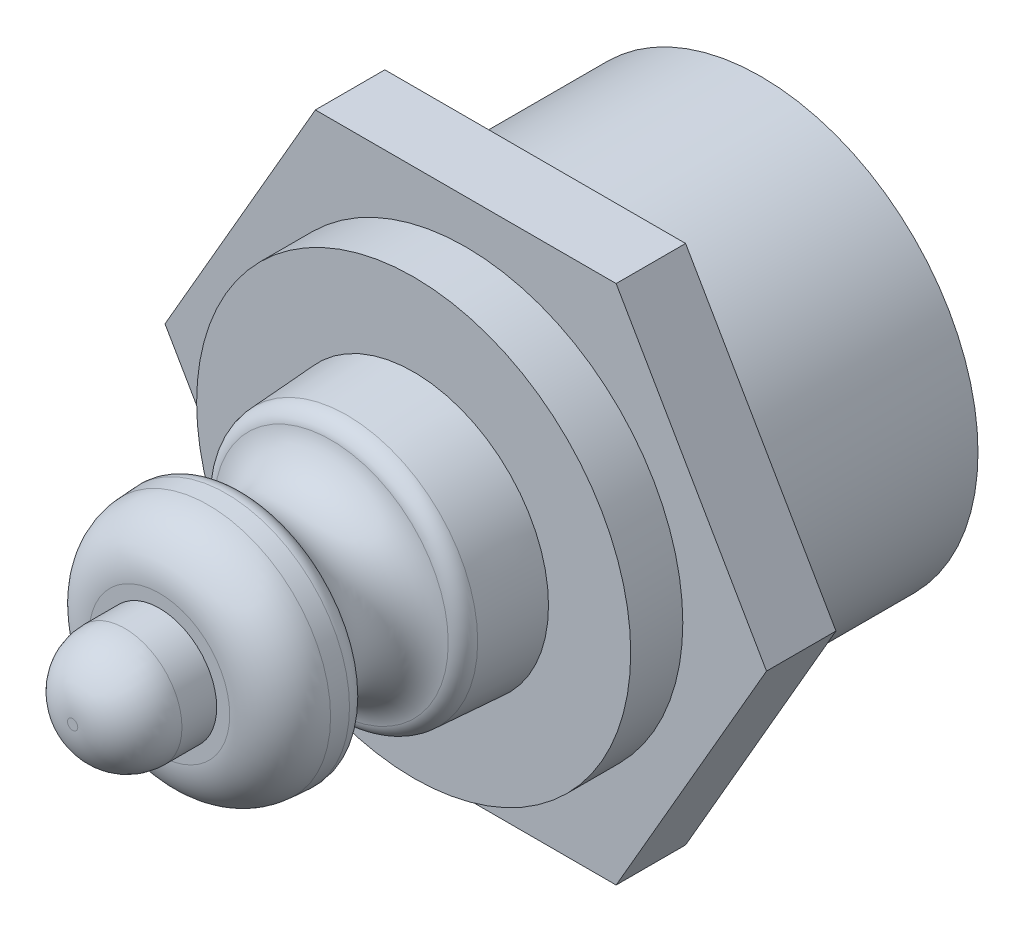
ISO-10303-21;
HEADER;
FILE_DESCRIPTION(('STEP AP214'),'2;1');
FILE_NAME('part.step','',(''),(''),'','','');
FILE_SCHEMA(('AUTOMOTIVE_DESIGN { 1 0 10303 214 1 1 1 1 }'));
ENDSEC;
DATA;
#1=APPLICATION_CONTEXT('core data for automotive mechanical design processes');
#2=APPLICATION_PROTOCOL_DEFINITION('international standard','automotive_design',2000,#1);
#3=PRODUCT_CONTEXT('',#1,'mechanical');
#4=PRODUCT('Part','Part','',(#3));
#5=PRODUCT_RELATED_PRODUCT_CATEGORY('part','',(#4));
#6=PRODUCT_DEFINITION_FORMATION('','',#4);
#7=PRODUCT_DEFINITION_CONTEXT('part definition',#1,'design');
#8=PRODUCT_DEFINITION('design','',#6,#7);
#9=PRODUCT_DEFINITION_SHAPE('','',#8);
#10=(LENGTH_UNIT() NAMED_UNIT(*) SI_UNIT(.MILLI.,.METRE.));
#11=(NAMED_UNIT(*) PLANE_ANGLE_UNIT() SI_UNIT($,.RADIAN.));
#12=(NAMED_UNIT(*) SI_UNIT($,.STERADIAN.) SOLID_ANGLE_UNIT());
#13=UNCERTAINTY_MEASURE_WITH_UNIT(LENGTH_MEASURE(1.E-05),#10,'distance_accuracy_value','');
#14=(GEOMETRIC_REPRESENTATION_CONTEXT(3) GLOBAL_UNCERTAINTY_ASSIGNED_CONTEXT((#13)) GLOBAL_UNIT_ASSIGNED_CONTEXT((#10,
#11,#12)) REPRESENTATION_CONTEXT('',''));
#15=CARTESIAN_POINT('',(0.,0.,0.));
#16=DIRECTION('',(0.,0.,1.));
#17=DIRECTION('',(1.,0.,0.));
#18=AXIS2_PLACEMENT_3D('',#15,#16,#17);
#19=CARTESIAN_POINT('',(-4.36075673625272,0.,21.9961999834404));
#20=DIRECTION('',(0.,0.,1.));
#21=DIRECTION('',(1.,0.,0.));
#22=AXIS2_PLACEMENT_3D('',#19,#20,#21);
#23=PLANE('',#22);
#24=CARTESIAN_POINT('',(0.,0.,21.9961999834404));
#25=DIRECTION('',(0.,0.,1.));
#26=DIRECTION('',(1.,0.,0.));
#27=AXIS2_PLACEMENT_3D('',#24,#25,#26);
#28=CIRCLE('',#27,2.56904320901737);
#29=CARTESIAN_POINT('',(2.56904320901737,0.,21.9961999834404));
#30=VERTEX_POINT('',#29);
#31=EDGE_CURVE('E160',#30,#30,#28,.T.);
#32=ORIENTED_EDGE('',*,*,#31,.T.);
#33=EDGE_LOOP('',(#32));
#34=FACE_BOUND('',#33,.T.);
#35=CARTESIAN_POINT('',(0.,0.,21.9961999834404));
#36=DIRECTION('',(0.,0.,1.));
#37=DIRECTION('',(1.,0.,0.));
#38=AXIS2_PLACEMENT_3D('',#35,#36,#37);
#39=CIRCLE('',#38,2.09240752733974);
#40=CARTESIAN_POINT('',(2.09240752733974,0.,21.9961999834404));
#41=VERTEX_POINT('',#40);
#42=EDGE_CURVE('E123',#41,#41,#39,.T.);
#43=ORIENTED_EDGE('',*,*,#42,.F.);
#44=EDGE_LOOP('',(#43));
#45=FACE_BOUND('',#44,.T.);
#46=ADVANCED_FACE('F30',(#34,#45),#23,.T.);
#47=CARTESIAN_POINT('',(0.,0.,12.7));
#48=DIRECTION('',(0.,0.,-1.));
#49=DIRECTION('',(-1.,0.,0.));
#50=AXIS2_PLACEMENT_3D('',#47,#48,#49);
#51=CYLINDRICAL_SURFACE('',#50,7.9375);
#52=CARTESIAN_POINT('',(0.,0.,0.));
#53=DIRECTION('',(0.,0.,1.));
#54=DIRECTION('',(1.,0.,0.));
#55=AXIS2_PLACEMENT_3D('',#52,#53,#54);
#56=CIRCLE('',#55,7.9375);
#57=CARTESIAN_POINT('',(7.9375,0.,0.));
#58=VERTEX_POINT('',#57);
#59=EDGE_CURVE('E147',#58,#58,#56,.T.);
#60=ORIENTED_EDGE('',*,*,#59,.T.);
#61=EDGE_LOOP('',(#60));
#62=FACE_BOUND('',#61,.T.);
#63=CARTESIAN_POINT('',(0.,0.,8.255));
#64=DIRECTION('',(0.,0.,1.));
#65=DIRECTION('',(1.,0.,0.));
#66=AXIS2_PLACEMENT_3D('',#63,#64,#65);
#67=CIRCLE('',#66,7.9375);
#68=CARTESIAN_POINT('',(7.9375,0.,8.255));
#69=VERTEX_POINT('',#68);
#70=EDGE_CURVE('E146',#69,#69,#67,.T.);
#71=ORIENTED_EDGE('',*,*,#70,.F.);
#72=EDGE_LOOP('',(#71));
#73=FACE_BOUND('',#72,.T.);
#74=ADVANCED_FACE('F203',(#62,#73),#51,.T.);
#75=CARTESIAN_POINT('',(0.,0.,0.));
#76=DIRECTION('',(0.,0.,1.));
#77=DIRECTION('',(1.,0.,0.));
#78=AXIS2_PLACEMENT_3D('',#75,#76,#77);
#79=PLANE('',#78);
#80=ORIENTED_EDGE('',*,*,#59,.F.);
#81=EDGE_LOOP('',(#80));
#82=FACE_BOUND('',#81,.T.);
#83=ADVANCED_FACE('F209',(#82),#79,.F.);
#84=CARTESIAN_POINT('',(5.49926131403119,9.525,8.255));
#85=DIRECTION('',(0.,0.,1.));
#86=DIRECTION('',(1.,0.,0.));
#87=AXIS2_PLACEMENT_3D('',#84,#85,#86);
#88=PLANE('',#87);
#89=DIRECTION('',(-0.5,0.866025403784439,0.));
#90=VECTOR('',#89,1.);
#91=CARTESIAN_POINT('',(10.9985226280624,0.,8.255));
#92=LINE('',#91,#90);
#93=CARTESIAN_POINT('',(10.9985226280624,0.,8.255));
#94=VERTEX_POINT('',#93);
#95=CARTESIAN_POINT('',(5.49926131403119,9.525,8.255));
#96=VERTEX_POINT('',#95);
#97=EDGE_CURVE('E135',#94,#96,#92,.T.);
#98=ORIENTED_EDGE('',*,*,#97,.F.);
#99=DIRECTION('',(0.5,0.866025403784439,0.));
#100=VECTOR('',#99,1.);
#101=CARTESIAN_POINT('',(5.49926131403118,-9.525,8.255));
#102=LINE('',#101,#100);
#103=CARTESIAN_POINT('',(5.49926131403118,-9.525,8.255));
#104=VERTEX_POINT('',#103);
#105=EDGE_CURVE('E109',#104,#94,#102,.T.);
#106=ORIENTED_EDGE('',*,*,#105,.F.);
#107=DIRECTION('',(1.,0.,0.));
#108=VECTOR('',#107,1.);
#109=CARTESIAN_POINT('',(-5.49926131403119,-9.525,8.255));
#110=LINE('',#109,#108);
#111=CARTESIAN_POINT('',(-5.49926131403119,-9.525,8.255));
#112=VERTEX_POINT('',#111);
#113=EDGE_CURVE('E93',#112,#104,#110,.T.);
#114=ORIENTED_EDGE('',*,*,#113,.F.);
#115=DIRECTION('',(0.5,-0.866025403784439,0.));
#116=VECTOR('',#115,1.);
#117=CARTESIAN_POINT('',(-10.9985226280624,0.,8.255));
#118=LINE('',#117,#116);
#119=CARTESIAN_POINT('',(-10.9985226280624,0.,8.255));
#120=VERTEX_POINT('',#119);
#121=EDGE_CURVE('E107',#120,#112,#118,.T.);
#122=ORIENTED_EDGE('',*,*,#121,.F.);
#123=DIRECTION('',(-0.5,-0.866025403784439,0.));
#124=VECTOR('',#123,1.);
#125=CARTESIAN_POINT('',(-5.49926131403119,9.525,8.255));
#126=LINE('',#125,#124);
#127=CARTESIAN_POINT('',(-5.49926131403119,9.525,8.255));
#128=VERTEX_POINT('',#127);
#129=EDGE_CURVE('E112',#128,#120,#126,.T.);
#130=ORIENTED_EDGE('',*,*,#129,.F.);
#131=DIRECTION('',(-1.,0.,0.));
#132=VECTOR('',#131,1.);
#133=CARTESIAN_POINT('',(5.49926131403119,9.525,8.255));
#134=LINE('',#133,#132);
#135=EDGE_CURVE('E114',#96,#128,#134,.T.);
#136=ORIENTED_EDGE('',*,*,#135,.F.);
#137=EDGE_LOOP('',(#98,#106,#114,#122,#130,#136));
#138=FACE_BOUND('',#137,.T.);
#139=ORIENTED_EDGE('',*,*,#70,.T.);
#140=EDGE_LOOP('',(#139));
#141=FACE_BOUND('',#140,.T.);
#142=ADVANCED_FACE('F104',(#138,#141),#88,.F.);
#143=CARTESIAN_POINT('',(5.49926131403119,9.525,10.795));
#144=DIRECTION('',(0.,0.,1.));
#145=DIRECTION('',(1.,0.,0.));
#146=AXIS2_PLACEMENT_3D('',#143,#144,#145);
#147=PLANE('',#146);
#148=DIRECTION('',(-0.5,0.866025403784439,0.));
#149=VECTOR('',#148,1.);
#150=CARTESIAN_POINT('',(10.9985226280624,0.,10.795));
#151=LINE('',#150,#149);
#152=CARTESIAN_POINT('',(10.9985226280624,0.,10.795));
#153=VERTEX_POINT('',#152);
#154=CARTESIAN_POINT('',(5.49926131403119,9.525,10.795));
#155=VERTEX_POINT('',#154);
#156=EDGE_CURVE('E119',#153,#155,#151,.T.);
#157=ORIENTED_EDGE('',*,*,#156,.T.);
#158=DIRECTION('',(-1.,0.,0.));
#159=VECTOR('',#158,1.);
#160=CARTESIAN_POINT('',(5.49926131403119,9.525,10.795));
#161=LINE('',#160,#159);
#162=CARTESIAN_POINT('',(-5.49926131403119,9.525,10.795));
#163=VERTEX_POINT('',#162);
#164=EDGE_CURVE('E122',#155,#163,#161,.T.);
#165=ORIENTED_EDGE('',*,*,#164,.T.);
#166=DIRECTION('',(-0.5,-0.866025403784439,0.));
#167=VECTOR('',#166,1.);
#168=CARTESIAN_POINT('',(-5.49926131403119,9.525,10.795));
#169=LINE('',#168,#167);
#170=CARTESIAN_POINT('',(-10.9985226280624,0.,10.795));
#171=VERTEX_POINT('',#170);
#172=EDGE_CURVE('E126',#163,#171,#169,.T.);
#173=ORIENTED_EDGE('',*,*,#172,.T.);
#174=DIRECTION('',(0.5,-0.866025403784439,0.));
#175=VECTOR('',#174,1.);
#176=CARTESIAN_POINT('',(-10.9985226280624,0.,10.795));
#177=LINE('',#176,#175);
#178=CARTESIAN_POINT('',(-5.49926131403119,-9.525,10.795));
#179=VERTEX_POINT('',#178);
#180=EDGE_CURVE('E129',#171,#179,#177,.T.);
#181=ORIENTED_EDGE('',*,*,#180,.T.);
#182=DIRECTION('',(1.,0.,0.));
#183=VECTOR('',#182,1.);
#184=CARTESIAN_POINT('',(-5.49926131403119,-9.525,10.795));
#185=LINE('',#184,#183);
#186=CARTESIAN_POINT('',(5.49926131403118,-9.525,10.795));
#187=VERTEX_POINT('',#186);
#188=EDGE_CURVE('E95',#179,#187,#185,.T.);
#189=ORIENTED_EDGE('',*,*,#188,.T.);
#190=DIRECTION('',(0.5,0.866025403784439,0.));
#191=VECTOR('',#190,1.);
#192=CARTESIAN_POINT('',(5.49926131403118,-9.525,10.795));
#193=LINE('',#192,#191);
#194=EDGE_CURVE('E132',#187,#153,#193,.T.);
#195=ORIENTED_EDGE('',*,*,#194,.T.);
#196=EDGE_LOOP('',(#157,#165,#173,#181,#189,#195));
#197=FACE_BOUND('',#196,.T.);
#198=CARTESIAN_POINT('',(0.,0.,10.795));
#199=DIRECTION('',(0.,0.,1.));
#200=DIRECTION('',(1.,0.,0.));
#201=AXIS2_PLACEMENT_3D('',#198,#199,#200);
#202=CIRCLE('',#201,7.9375);
#203=CARTESIAN_POINT('',(7.9375,0.,10.795));
#204=VERTEX_POINT('',#203);
#205=EDGE_CURVE('E137',#204,#204,#202,.T.);
#206=ORIENTED_EDGE('',*,*,#205,.F.);
#207=EDGE_LOOP('',(#206));
#208=FACE_BOUND('',#207,.T.);
#209=ADVANCED_FACE('F230',(#197,#208),#147,.T.);
#210=CARTESIAN_POINT('',(10.9985226280624,0.,8.255));
#211=DIRECTION('',(0.866025403784439,0.5,0.));
#212=DIRECTION('',(-0.5,0.866025403784439,0.));
#213=AXIS2_PLACEMENT_3D('',#210,#211,#212);
#214=PLANE('',#213);
#215=ORIENTED_EDGE('',*,*,#156,.F.);
#216=DIRECTION('',(0.,0.,1.));
#217=VECTOR('',#216,1.);
#218=CARTESIAN_POINT('',(10.9985226280624,0.,8.255));
#219=LINE('',#218,#217);
#220=EDGE_CURVE('E47',#94,#153,#219,.T.);
#221=ORIENTED_EDGE('',*,*,#220,.F.);
#222=ORIENTED_EDGE('',*,*,#97,.T.);
#223=DIRECTION('',(0.,0.,1.));
#224=VECTOR('',#223,1.);
#225=CARTESIAN_POINT('',(5.49926131403119,9.525,8.255));
#226=LINE('',#225,#224);
#227=EDGE_CURVE('E82',#96,#155,#226,.T.);
#228=ORIENTED_EDGE('',*,*,#227,.T.);
#229=EDGE_LOOP('',(#215,#221,#222,#228));
#230=FACE_BOUND('',#229,.T.);
#231=ADVANCED_FACE('F233',(#230),#214,.T.);
#232=CARTESIAN_POINT('',(5.49926131403118,-9.525,8.255));
#233=DIRECTION('',(0.866025403784439,-0.5,0.));
#234=DIRECTION('',(0.5,0.866025403784439,0.));
#235=AXIS2_PLACEMENT_3D('',#232,#233,#234);
#236=PLANE('',#235);
#237=ORIENTED_EDGE('',*,*,#194,.F.);
#238=DIRECTION('',(0.,0.,1.));
#239=VECTOR('',#238,1.);
#240=CARTESIAN_POINT('',(5.49926131403118,-9.525,8.255));
#241=LINE('',#240,#239);
#242=EDGE_CURVE('E70',#104,#187,#241,.T.);
#243=ORIENTED_EDGE('',*,*,#242,.F.);
#244=ORIENTED_EDGE('',*,*,#105,.T.);
#245=ORIENTED_EDGE('',*,*,#220,.T.);
#246=EDGE_LOOP('',(#237,#243,#244,#245));
#247=FACE_BOUND('',#246,.T.);
#248=ADVANCED_FACE('F235',(#247),#236,.T.);
#249=CARTESIAN_POINT('',(-5.49926131403119,-9.525,8.255));
#250=DIRECTION('',(0.,-1.,0.));
#251=DIRECTION('',(0.,0.,-1.));
#252=AXIS2_PLACEMENT_3D('',#249,#250,#251);
#253=PLANE('',#252);
#254=ORIENTED_EDGE('',*,*,#188,.F.);
#255=DIRECTION('',(0.,0.,1.));
#256=VECTOR('',#255,1.);
#257=CARTESIAN_POINT('',(-5.49926131403119,-9.525,8.255));
#258=LINE('',#257,#256);
#259=EDGE_CURVE('E90',#112,#179,#258,.T.);
#260=ORIENTED_EDGE('',*,*,#259,.F.);
#261=ORIENTED_EDGE('',*,*,#113,.T.);
#262=ORIENTED_EDGE('',*,*,#242,.T.);
#263=EDGE_LOOP('',(#254,#260,#261,#262));
#264=FACE_BOUND('',#263,.T.);
#265=ADVANCED_FACE('F92',(#264),#253,.T.);
#266=CARTESIAN_POINT('',(-10.9985226280624,0.,8.255));
#267=DIRECTION('',(-0.866025403784439,-0.5,0.));
#268=DIRECTION('',(0.5,-0.866025403784439,0.));
#269=AXIS2_PLACEMENT_3D('',#266,#267,#268);
#270=PLANE('',#269);
#271=ORIENTED_EDGE('',*,*,#180,.F.);
#272=DIRECTION('',(0.,0.,1.));
#273=VECTOR('',#272,1.);
#274=CARTESIAN_POINT('',(-10.9985226280624,0.,8.255));
#275=LINE('',#274,#273);
#276=EDGE_CURVE('E100',#120,#171,#275,.T.);
#277=ORIENTED_EDGE('',*,*,#276,.F.);
#278=ORIENTED_EDGE('',*,*,#121,.T.);
#279=ORIENTED_EDGE('',*,*,#259,.T.);
#280=EDGE_LOOP('',(#271,#277,#278,#279));
#281=FACE_BOUND('',#280,.T.);
#282=ADVANCED_FACE('F111',(#281),#270,.T.);
#283=CARTESIAN_POINT('',(-5.49926131403119,9.525,8.255));
#284=DIRECTION('',(-0.866025403784439,0.5,0.));
#285=DIRECTION('',(-0.5,-0.866025403784439,0.));
#286=AXIS2_PLACEMENT_3D('',#283,#284,#285);
#287=PLANE('',#286);
#288=ORIENTED_EDGE('',*,*,#172,.F.);
#289=DIRECTION('',(0.,0.,1.));
#290=VECTOR('',#289,1.);
#291=CARTESIAN_POINT('',(-5.49926131403119,9.525,8.255));
#292=LINE('',#291,#290);
#293=EDGE_CURVE('E140',#128,#163,#292,.T.);
#294=ORIENTED_EDGE('',*,*,#293,.F.);
#295=ORIENTED_EDGE('',*,*,#129,.T.);
#296=ORIENTED_EDGE('',*,*,#276,.T.);
#297=EDGE_LOOP('',(#288,#294,#295,#296));
#298=FACE_BOUND('',#297,.T.);
#299=ADVANCED_FACE('F242',(#298),#287,.T.);
#300=CARTESIAN_POINT('',(5.49926131403119,9.525,8.255));
#301=DIRECTION('',(0.,1.,0.));
#302=DIRECTION('',(0.,0.,1.));
#303=AXIS2_PLACEMENT_3D('',#300,#301,#302);
#304=PLANE('',#303);
#305=ORIENTED_EDGE('',*,*,#164,.F.);
#306=ORIENTED_EDGE('',*,*,#227,.F.);
#307=ORIENTED_EDGE('',*,*,#135,.T.);
#308=ORIENTED_EDGE('',*,*,#293,.T.);
#309=EDGE_LOOP('',(#305,#306,#307,#308));
#310=FACE_BOUND('',#309,.T.);
#311=ADVANCED_FACE('F196',(#310),#304,.T.);
#312=CARTESIAN_POINT('',(0.,0.,12.7));
#313=DIRECTION('',(0.,0.,1.));
#314=DIRECTION('',(1.,0.,0.));
#315=AXIS2_PLACEMENT_3D('',#312,#313,#314);
#316=PLANE('',#315);
#317=CARTESIAN_POINT('',(0.,0.,12.7));
#318=DIRECTION('',(0.,0.,1.));
#319=DIRECTION('',(1.,0.,0.));
#320=AXIS2_PLACEMENT_3D('',#317,#318,#319);
#321=CIRCLE('',#320,4.93105987437707);
#322=CARTESIAN_POINT('',(4.93105987437707,0.,12.7));
#323=VERTEX_POINT('',#322);
#324=EDGE_CURVE('E154',#323,#323,#321,.T.);
#325=ORIENTED_EDGE('',*,*,#324,.F.);
#326=EDGE_LOOP('',(#325));
#327=FACE_BOUND('',#326,.T.);
#328=CARTESIAN_POINT('',(0.,0.,12.7));
#329=DIRECTION('',(0.,0.,1.));
#330=DIRECTION('',(1.,0.,0.));
#331=AXIS2_PLACEMENT_3D('',#328,#329,#330);
#332=CIRCLE('',#331,7.9375);
#333=CARTESIAN_POINT('',(7.9375,0.,12.7));
#334=VERTEX_POINT('',#333);
#335=EDGE_CURVE('E143',#334,#334,#332,.T.);
#336=ORIENTED_EDGE('',*,*,#335,.T.);
#337=EDGE_LOOP('',(#336));
#338=FACE_BOUND('',#337,.T.);
#339=ADVANCED_FACE('F193',(#327,#338),#316,.T.);
#340=ORIENTED_EDGE('',*,*,#205,.T.);
#341=EDGE_LOOP('',(#340));
#342=FACE_BOUND('',#341,.T.);
#343=ORIENTED_EDGE('',*,*,#335,.F.);
#344=EDGE_LOOP('',(#343));
#345=FACE_BOUND('',#344,.T.);
#346=ADVANCED_FACE('F189',(#342,#345),#51,.T.);
#347=CARTESIAN_POINT('',(0.,0.,12.7));
#348=DIRECTION('',(0.,0.,-1.));
#349=DIRECTION('',(-1.,0.,0.));
#350=AXIS2_PLACEMENT_3D('',#347,#348,#349);
#351=CONICAL_SURFACE('',#350,4.93105987437707,0.0612711958459539);
#352=CARTESIAN_POINT('',(0.,0.,15.1395456022859));
#353=DIRECTION('',(0.,0.,1.));
#354=DIRECTION('',(1.,0.,0.));
#355=AXIS2_PLACEMENT_3D('',#352,#353,#354);
#356=CIRCLE('',#355,4.78139866710319);
#357=CARTESIAN_POINT('',(4.78139866710319,0.,15.1395456022859));
#358=VERTEX_POINT('',#357);
#359=EDGE_CURVE('E169',#358,#358,#356,.F.);
#360=ORIENTED_EDGE('',*,*,#359,.T.);
#361=EDGE_LOOP('',(#360));
#362=FACE_BOUND('',#361,.T.);
#363=ORIENTED_EDGE('',*,*,#324,.T.);
#364=EDGE_LOOP('',(#363));
#365=FACE_BOUND('',#364,.T.);
#366=ADVANCED_FACE('F186',(#362,#365),#351,.T.);
#367=CARTESIAN_POINT('',(0.,0.,17.3480999917202));
#368=DIRECTION('',(0.,0.,-1.));
#369=DIRECTION('',(-1.,0.,0.));
#370=AXIS2_PLACEMENT_3D('',#367,#368,#369);
#371=TOROIDAL_SURFACE('',#370,4.64590830531489,1.66701979340471);
#372=CARTESIAN_POINT('',(0.,0.,15.7206064286464));
#373=DIRECTION('',(0.,0.,1.));
#374=DIRECTION('',(1.,0.,0.));
#375=AXIS2_PLACEMENT_3D('',#372,#373,#374);
#376=CIRCLE('',#375,4.28504864595066);
#377=CARTESIAN_POINT('',(4.28504864595066,0.,15.7206064286464));
#378=VERTEX_POINT('',#377);
#379=EDGE_CURVE('E39',#378,#378,#376,.T.);
#380=ORIENTED_EDGE('',*,*,#379,.T.);
#381=EDGE_LOOP('',(#380));
#382=FACE_BOUND('',#381,.T.);
#383=CARTESIAN_POINT('',(0.,0.,18.9192790834567));
#384=DIRECTION('',(0.,0.,-1.));
#385=DIRECTION('',(-1.,0.,0.));
#386=AXIS2_PLACEMENT_3D('',#383,#384,#385);
#387=CIRCLE('',#386,4.08881652356513);
#388=CARTESIAN_POINT('',(-4.08881652356513,0.,18.9192790834567));
#389=VERTEX_POINT('',#388);
#390=EDGE_CURVE('E172',#389,#389,#387,.T.);
#391=ORIENTED_EDGE('',*,*,#390,.T.);
#392=EDGE_LOOP('',(#391));
#393=FACE_BOUND('',#392,.T.);
#394=ADVANCED_FACE('F177',(#382,#393),#371,.F.);
#395=CARTESIAN_POINT('',(0.,0.,19.0119916348925));
#396=DIRECTION('',(0.,0.,-1.));
#397=DIRECTION('',(-1.,0.,0.));
#398=AXIS2_PLACEMENT_3D('',#395,#396,#397);
#399=CONICAL_SURFACE('',#398,4.54383190557195,0.0612711958459539);
#400=CARTESIAN_POINT('',(0.,0.,19.5566543811545));
#401=DIRECTION('',(0.,0.,1.));
#402=DIRECTION('',(1.,0.,0.));
#403=AXIS2_PLACEMENT_3D('',#400,#401,#402);
#404=CIRCLE('',#403,4.5104179435266);
#405=CARTESIAN_POINT('',(4.5104179435266,0.,19.5566543811545));
#406=VERTEX_POINT('',#405);
#407=EDGE_CURVE('E11',#406,#406,#404,.T.);
#408=ORIENTED_EDGE('',*,*,#407,.T.);
#409=EDGE_LOOP('',(#408));
#410=FACE_BOUND('',#409,.T.);
#411=CARTESIAN_POINT('',(0.,0.,20.2078485933008));
#412=DIRECTION('',(0.,0.,1.));
#413=DIRECTION('',(1.,0.,0.));
#414=AXIS2_PLACEMENT_3D('',#411,#412,#413);
#415=CIRCLE('',#414,4.47046849069889);
#416=CARTESIAN_POINT('',(4.47046849069889,0.,20.2078485933008));
#417=VERTEX_POINT('',#416);
#418=EDGE_CURVE('E157',#417,#417,#415,.F.);
#419=ORIENTED_EDGE('',*,*,#418,.T.);
#420=EDGE_LOOP('',(#419));
#421=FACE_BOUND('',#420,.T.);
#422=ADVANCED_FACE('F221',(#410,#421),#399,.T.);
#423=CARTESIAN_POINT('',(0.,0.,20.0911999834404));
#424=DIRECTION('',(0.,0.,1.));
#425=DIRECTION('',(1.,0.,0.));
#426=AXIS2_PLACEMENT_3D('',#423,#424,#425);
#427=TOROIDAL_SURFACE('',#426,2.56904320901737,1.905);
#428=ORIENTED_EDGE('',*,*,#31,.F.);
#429=EDGE_LOOP('',(#428));
#430=FACE_BOUND('',#429,.T.);
#431=ORIENTED_EDGE('',*,*,#418,.F.);
#432=EDGE_LOOP('',(#431));
#433=FACE_BOUND('',#432,.T.);
#434=ADVANCED_FACE('F224',(#430,#433),#427,.T.);
#435=CARTESIAN_POINT('',(0.,0.,25.1711999834404));
#436=DIRECTION('',(0.,0.,-1.));
#437=DIRECTION('',(-1.,0.,0.));
#438=AXIS2_PLACEMENT_3D('',#435,#436,#437);
#439=CYLINDRICAL_SURFACE('',#438,2.09240752733974);
#440=CARTESIAN_POINT('',(0.,0.,23.2661999834404));
#441=DIRECTION('',(0.,0.,1.));
#442=DIRECTION('',(1.,0.,0.));
#443=AXIS2_PLACEMENT_3D('',#440,#441,#442);
#444=CIRCLE('',#443,2.09240752733974);
#445=CARTESIAN_POINT('',(2.09240752733974,0.,23.2661999834404));
#446=VERTEX_POINT('',#445);
#447=EDGE_CURVE('E166',#446,#446,#444,.F.);
#448=ORIENTED_EDGE('',*,*,#447,.T.);
#449=EDGE_LOOP('',(#448));
#450=FACE_BOUND('',#449,.T.);
#451=ORIENTED_EDGE('',*,*,#42,.T.);
#452=EDGE_LOOP('',(#451));
#453=FACE_BOUND('',#452,.T.);
#454=ADVANCED_FACE('F219',(#450,#453),#439,.T.);
#455=CARTESIAN_POINT('',(0.,0.,25.1711999834404));
#456=DIRECTION('',(0.,0.,1.));
#457=DIRECTION('',(1.,0.,0.));
#458=AXIS2_PLACEMENT_3D('',#455,#456,#457);
#459=PLANE('',#458);
#460=CARTESIAN_POINT('',(0.,0.,25.1711999834404));
#461=DIRECTION('',(0.,0.,1.));
#462=DIRECTION('',(1.,0.,0.));
#463=AXIS2_PLACEMENT_3D('',#460,#461,#462);
#464=CIRCLE('',#463,0.187407527339743);
#465=CARTESIAN_POINT('',(0.187407527339743,0.,25.1711999834404));
#466=VERTEX_POINT('',#465);
#467=EDGE_CURVE('E163',#466,#466,#464,.T.);
#468=ORIENTED_EDGE('',*,*,#467,.T.);
#469=EDGE_LOOP('',(#468));
#470=FACE_BOUND('',#469,.T.);
#471=ADVANCED_FACE('F318',(#470),#459,.T.);
#472=CARTESIAN_POINT('',(0.,0.,23.2661999834404));
#473=DIRECTION('',(0.,0.,1.));
#474=DIRECTION('',(1.,0.,0.));
#475=AXIS2_PLACEMENT_3D('',#472,#473,#474);
#476=DEGENERATE_TOROIDAL_SURFACE('',#475,0.187407527339743,1.905,.T.);
#477=ORIENTED_EDGE('',*,*,#447,.F.);
#478=EDGE_LOOP('',(#477));
#479=FACE_BOUND('',#478,.T.);
#480=ORIENTED_EDGE('',*,*,#467,.F.);
#481=EDGE_LOOP('',(#480));
#482=FACE_BOUND('',#481,.T.);
#483=ADVANCED_FACE('F183',(#479,#482),#476,.T.);
#484=CARTESIAN_POINT('',(0.,0.,15.1006627323325));
#485=DIRECTION('',(0.,0.,1.));
#486=DIRECTION('',(1.,0.,0.));
#487=AXIS2_PLACEMENT_3D('',#484,#485,#486);
#488=TOROIDAL_SURFACE('',#487,4.14759023987602,0.635);
#489=ORIENTED_EDGE('',*,*,#379,.F.);
#490=EDGE_LOOP('',(#489));
#491=FACE_BOUND('',#490,.T.);
#492=ORIENTED_EDGE('',*,*,#359,.F.);
#493=EDGE_LOOP('',(#492));
#494=FACE_BOUND('',#493,.T.);
#495=ADVANCED_FACE('F180',(#491,#494),#488,.T.);
#496=CARTESIAN_POINT('',(0.,0.,19.5177715112011));
#497=DIRECTION('',(0.,0.,1.));
#498=DIRECTION('',(1.,0.,0.));
#499=AXIS2_PLACEMENT_3D('',#496,#497,#498);
#500=TOROIDAL_SURFACE('',#499,3.87660951629942,0.635);
#501=ORIENTED_EDGE('',*,*,#407,.F.);
#502=EDGE_LOOP('',(#501));
#503=FACE_BOUND('',#502,.T.);
#504=ORIENTED_EDGE('',*,*,#390,.F.);
#505=EDGE_LOOP('',(#504));
#506=FACE_BOUND('',#505,.T.);
#507=ADVANCED_FACE('F32',(#503,#506),#500,.T.);
#508=CLOSED_SHELL('',(#46,#74,#83,#142,#209,#231,#248,#265,#282,#299,#311,#339,#346,#366,#394,
#422,#434,#454,#471,#483,#495,#507));
#509=MANIFOLD_SOLID_BREP('B2',#508);
#510=ADVANCED_BREP_SHAPE_REPRESENTATION('',(#18,#509),#14);
#511=SHAPE_DEFINITION_REPRESENTATION(#9,#510);
ENDSEC;
END-ISO-10303-21;
